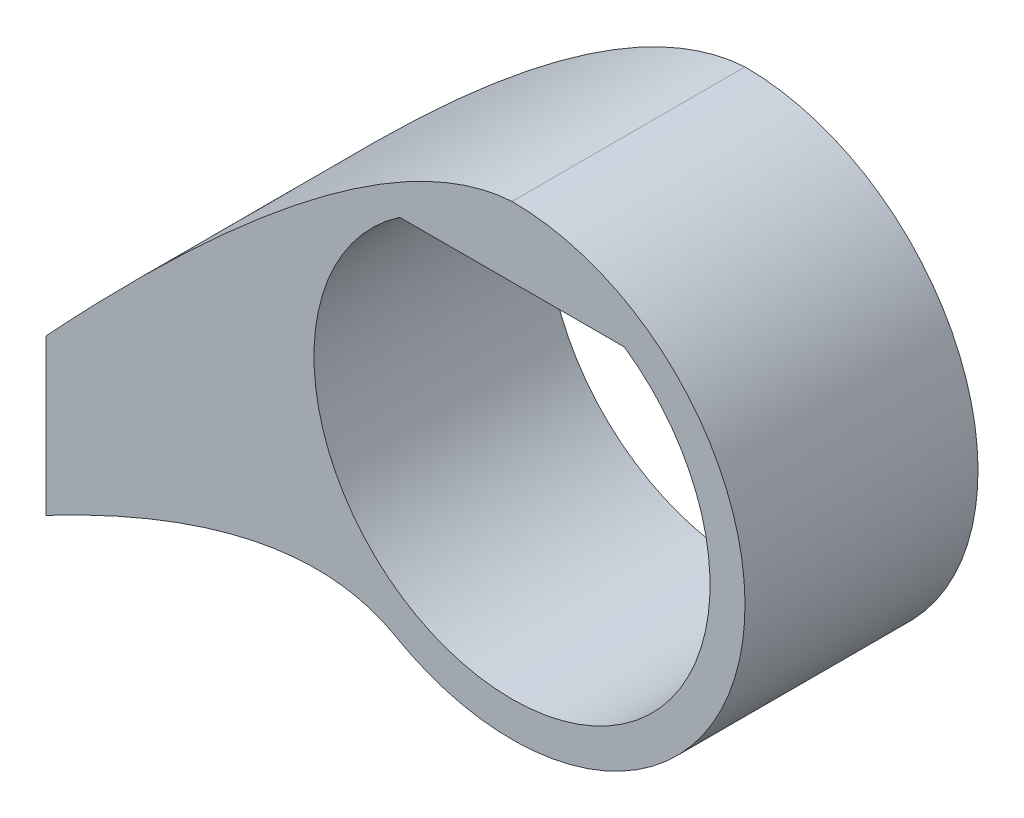
ISO-10303-21;
HEADER;
FILE_DESCRIPTION(('STEP AP214'),'2;1');
FILE_NAME('part.step','',(''),(''),'','','');
FILE_SCHEMA(('AUTOMOTIVE_DESIGN { 1 0 10303 214 1 1 1 1 }'));
ENDSEC;
DATA;
#1=APPLICATION_CONTEXT('core data for automotive mechanical design processes');
#2=APPLICATION_PROTOCOL_DEFINITION('international standard','automotive_design',2000,#1);
#3=PRODUCT_CONTEXT('',#1,'mechanical');
#4=PRODUCT('Part','Part','',(#3));
#5=PRODUCT_RELATED_PRODUCT_CATEGORY('part','',(#4));
#6=PRODUCT_DEFINITION_FORMATION('','',#4);
#7=PRODUCT_DEFINITION_CONTEXT('part definition',#1,'design');
#8=PRODUCT_DEFINITION('design','',#6,#7);
#9=PRODUCT_DEFINITION_SHAPE('','',#8);
#10=(LENGTH_UNIT() NAMED_UNIT(*) SI_UNIT(.MILLI.,.METRE.));
#11=(NAMED_UNIT(*) PLANE_ANGLE_UNIT() SI_UNIT($,.RADIAN.));
#12=(NAMED_UNIT(*) SI_UNIT($,.STERADIAN.) SOLID_ANGLE_UNIT());
#13=UNCERTAINTY_MEASURE_WITH_UNIT(LENGTH_MEASURE(1.E-05),#10,'distance_accuracy_value','');
#14=(GEOMETRIC_REPRESENTATION_CONTEXT(3) GLOBAL_UNCERTAINTY_ASSIGNED_CONTEXT((#13)) GLOBAL_UNIT_ASSIGNED_CONTEXT((#10,
#11,#12)) REPRESENTATION_CONTEXT('',''));
#15=CARTESIAN_POINT('',(0.,0.,0.));
#16=DIRECTION('',(0.,0.,1.));
#17=DIRECTION('',(1.,0.,0.));
#18=AXIS2_PLACEMENT_3D('',#15,#16,#17);
#19=CARTESIAN_POINT('',(-6.57712056852136,-4.88090089954708,6.));
#20=DIRECTION('',(0.,0.,1.));
#21=DIRECTION('',(1.,0.,0.));
#22=AXIS2_PLACEMENT_3D('',#19,#20,#21);
#23=PLANE('',#22);
#24=CARTESIAN_POINT('',(-12.,-7.,6.));
#25=CARTESIAN_POINT('',(-5.65424113704272,-3.66372558774084,6.));
#26=CARTESIAN_POINT('',(-3.,-5.19615242270663,6.));
#27=B_SPLINE_CURVE_WITH_KNOTS('',2,(#24,#25,#26),.UNSPECIFIED.,.F.,.F.,(3,3),(0.,
0.361848159329166),.UNSPECIFIED.);
#28=CARTESIAN_POINT('',(-12.,-7.,6.));
#29=VERTEX_POINT('',#28);
#30=CARTESIAN_POINT('',(-3.,-5.19615242270663,6.));
#31=VERTEX_POINT('',#30);
#32=EDGE_CURVE('E110',#29,#31,#27,.T.);
#33=ORIENTED_EDGE('',*,*,#32,.T.);
#34=CARTESIAN_POINT('',(0.,0.,6.));
#35=DIRECTION('',(0.,0.,1.));
#36=DIRECTION('',(1.,0.,0.));
#37=AXIS2_PLACEMENT_3D('',#34,#35,#36);
#38=CIRCLE('',#37,6.);
#39=CARTESIAN_POINT('',(0.,6.,6.));
#40=VERTEX_POINT('',#39);
#41=EDGE_CURVE('E116',#31,#40,#38,.T.);
#42=ORIENTED_EDGE('',*,*,#41,.T.);
#43=CARTESIAN_POINT('',(0.,6.,6.));
#44=CARTESIAN_POINT('',(-3.84641453313255,5.77126829641687,6.));
#45=CARTESIAN_POINT('',(-12.,-3.,6.));
#46=B_SPLINE_CURVE_WITH_KNOTS('',2,(#43,#44,#45),.UNSPECIFIED.,.F.,.F.,(3,3),(0.,
0.663529029496582),.UNSPECIFIED.);
#47=CARTESIAN_POINT('',(-12.,-3.,6.));
#48=VERTEX_POINT('',#47);
#49=EDGE_CURVE('E122',#40,#48,#46,.T.);
#50=ORIENTED_EDGE('',*,*,#49,.T.);
#51=DIRECTION('',(0.,-1.,0.));
#52=VECTOR('',#51,1.);
#53=CARTESIAN_POINT('',(-12.,-7.,6.));
#54=LINE('',#53,#52);
#55=EDGE_CURVE('E127',#48,#29,#54,.T.);
#56=ORIENTED_EDGE('',*,*,#55,.T.);
#57=EDGE_LOOP('',(#33,#42,#50,#56));
#58=FACE_BOUND('',#57,.T.);
#59=DIRECTION('',(-1.,0.,0.));
#60=VECTOR('',#59,1.);
#61=CARTESIAN_POINT('',(2.89309522829788,4.2,6.));
#62=LINE('',#61,#60);
#63=CARTESIAN_POINT('',(2.89309522829789,4.2,6.));
#64=VERTEX_POINT('',#63);
#65=CARTESIAN_POINT('',(-2.89309522829788,4.2,6.));
#66=VERTEX_POINT('',#65);
#67=EDGE_CURVE('E94',#64,#66,#62,.T.);
#68=ORIENTED_EDGE('',*,*,#67,.F.);
#69=CARTESIAN_POINT('',(0.,0.,6.));
#70=DIRECTION('',(0.,0.,1.));
#71=DIRECTION('',(1.,0.,0.));
#72=AXIS2_PLACEMENT_3D('',#69,#70,#71);
#73=CIRCLE('',#72,5.1);
#74=EDGE_CURVE('E100',#66,#64,#73,.T.);
#75=ORIENTED_EDGE('',*,*,#74,.F.);
#76=EDGE_LOOP('',(#68,#75));
#77=FACE_BOUND('',#76,.T.);
#78=ADVANCED_FACE('F41',(#58,#77),#23,.T.);
#79=CARTESIAN_POINT('',(-6.57712056852136,-4.88090089954708,0.));
#80=DIRECTION('',(0.,0.,1.));
#81=DIRECTION('',(1.,0.,0.));
#82=AXIS2_PLACEMENT_3D('',#79,#80,#81);
#83=PLANE('',#82);
#84=CARTESIAN_POINT('',(-12.,-7.,0.));
#85=CARTESIAN_POINT('',(-5.65424113704272,-3.66372558774084,0.));
#86=CARTESIAN_POINT('',(-3.,-5.19615242270663,0.));
#87=B_SPLINE_CURVE_WITH_KNOTS('',2,(#84,#85,#86),.UNSPECIFIED.,.F.,.F.,(3,3),(0.,
0.361848159329166),.UNSPECIFIED.);
#88=CARTESIAN_POINT('',(-12.,-7.,0.));
#89=VERTEX_POINT('',#88);
#90=CARTESIAN_POINT('',(-3.,-5.19615242270663,0.));
#91=VERTEX_POINT('',#90);
#92=EDGE_CURVE('E109',#89,#91,#87,.T.);
#93=ORIENTED_EDGE('',*,*,#92,.F.);
#94=DIRECTION('',(0.,-1.,0.));
#95=VECTOR('',#94,1.);
#96=CARTESIAN_POINT('',(-12.,-7.,0.));
#97=LINE('',#96,#95);
#98=CARTESIAN_POINT('',(-12.,-3.,0.));
#99=VERTEX_POINT('',#98);
#100=EDGE_CURVE('E117',#99,#89,#97,.T.);
#101=ORIENTED_EDGE('',*,*,#100,.F.);
#102=CARTESIAN_POINT('',(0.,6.,0.));
#103=CARTESIAN_POINT('',(-3.84641453313255,5.77126829641687,0.));
#104=CARTESIAN_POINT('',(-12.,-3.,0.));
#105=B_SPLINE_CURVE_WITH_KNOTS('',2,(#102,#103,#104),.UNSPECIFIED.,.F.,.F.,(3,3),(0.,
0.663529029496582),.UNSPECIFIED.);
#106=CARTESIAN_POINT('',(0.,6.,0.));
#107=VERTEX_POINT('',#106);
#108=EDGE_CURVE('E215',#107,#99,#105,.T.);
#109=ORIENTED_EDGE('',*,*,#108,.F.);
#110=CARTESIAN_POINT('',(0.,0.,0.));
#111=DIRECTION('',(0.,0.,1.));
#112=DIRECTION('',(1.,0.,0.));
#113=AXIS2_PLACEMENT_3D('',#110,#111,#112);
#114=CIRCLE('',#113,6.);
#115=EDGE_CURVE('E221',#91,#107,#114,.T.);
#116=ORIENTED_EDGE('',*,*,#115,.F.);
#117=EDGE_LOOP('',(#93,#101,#109,#116));
#118=FACE_BOUND('',#117,.T.);
#119=CARTESIAN_POINT('',(0.,0.,0.));
#120=DIRECTION('',(0.,0.,1.));
#121=DIRECTION('',(1.,0.,0.));
#122=AXIS2_PLACEMENT_3D('',#119,#120,#121);
#123=CIRCLE('',#122,5.1);
#124=CARTESIAN_POINT('',(-2.89309522829788,4.2,0.));
#125=VERTEX_POINT('',#124);
#126=CARTESIAN_POINT('',(2.89309522829788,4.2,0.));
#127=VERTEX_POINT('',#126);
#128=EDGE_CURVE('E64',#125,#127,#123,.T.);
#129=ORIENTED_EDGE('',*,*,#128,.T.);
#130=DIRECTION('',(-1.,0.,0.));
#131=VECTOR('',#130,1.);
#132=CARTESIAN_POINT('',(2.89309522829788,4.2,0.));
#133=LINE('',#132,#131);
#134=EDGE_CURVE('E104',#127,#125,#133,.T.);
#135=ORIENTED_EDGE('',*,*,#134,.T.);
#136=EDGE_LOOP('',(#129,#135));
#137=FACE_BOUND('',#136,.T.);
#138=ADVANCED_FACE('F145',(#118,#137),#83,.F.);
#139=DIRECTION('',(0.,0.,-1.));
#140=VECTOR('',#139,1.);
#141=SURFACE_OF_LINEAR_EXTRUSION('',#27,#140);
#142=ORIENTED_EDGE('',*,*,#92,.T.);
#143=DIRECTION('',(0.,0.,-1.));
#144=VECTOR('',#143,1.);
#145=CARTESIAN_POINT('',(-3.,-5.19615242270663,6.));
#146=LINE('',#145,#144);
#147=EDGE_CURVE('E11',#31,#91,#146,.T.);
#148=ORIENTED_EDGE('',*,*,#147,.F.);
#149=ORIENTED_EDGE('',*,*,#32,.F.);
#150=DIRECTION('',(0.,0.,-1.));
#151=VECTOR('',#150,1.);
#152=CARTESIAN_POINT('',(-12.,-7.,6.));
#153=LINE('',#152,#151);
#154=EDGE_CURVE('E209',#29,#89,#153,.T.);
#155=ORIENTED_EDGE('',*,*,#154,.T.);
#156=EDGE_LOOP('',(#142,#148,#149,#155));
#157=FACE_BOUND('',#156,.T.);
#158=ADVANCED_FACE('F43',(#157),#141,.F.);
#159=CARTESIAN_POINT('',(0.,0.,6.));
#160=DIRECTION('',(0.,0.,-1.));
#161=DIRECTION('',(-1.,0.,0.));
#162=AXIS2_PLACEMENT_3D('',#159,#160,#161);
#163=CYLINDRICAL_SURFACE('',#162,6.);
#164=ORIENTED_EDGE('',*,*,#115,.T.);
#165=DIRECTION('',(0.,0.,-1.));
#166=VECTOR('',#165,1.);
#167=CARTESIAN_POINT('',(0.,6.,6.));
#168=LINE('',#167,#166);
#169=EDGE_CURVE('E50',#40,#107,#168,.T.);
#170=ORIENTED_EDGE('',*,*,#169,.F.);
#171=ORIENTED_EDGE('',*,*,#41,.F.);
#172=ORIENTED_EDGE('',*,*,#147,.T.);
#173=EDGE_LOOP('',(#164,#170,#171,#172));
#174=FACE_BOUND('',#173,.T.);
#175=ADVANCED_FACE('F137',(#174),#163,.T.);
#176=DIRECTION('',(0.,0.,-1.));
#177=VECTOR('',#176,1.);
#178=SURFACE_OF_LINEAR_EXTRUSION('',#46,#177);
#179=ORIENTED_EDGE('',*,*,#108,.T.);
#180=DIRECTION('',(0.,0.,-1.));
#181=VECTOR('',#180,1.);
#182=CARTESIAN_POINT('',(-12.,-3.,6.));
#183=LINE('',#182,#181);
#184=EDGE_CURVE('E212',#48,#99,#183,.T.);
#185=ORIENTED_EDGE('',*,*,#184,.F.);
#186=ORIENTED_EDGE('',*,*,#49,.F.);
#187=ORIENTED_EDGE('',*,*,#169,.T.);
#188=EDGE_LOOP('',(#179,#185,#186,#187));
#189=FACE_BOUND('',#188,.T.);
#190=ADVANCED_FACE('F133',(#189),#178,.F.);
#191=CARTESIAN_POINT('',(-12.,-7.,6.));
#192=DIRECTION('',(1.,0.,0.));
#193=DIRECTION('',(0.,0.,-1.));
#194=AXIS2_PLACEMENT_3D('',#191,#192,#193);
#195=PLANE('',#194);
#196=ORIENTED_EDGE('',*,*,#100,.T.);
#197=ORIENTED_EDGE('',*,*,#154,.F.);
#198=ORIENTED_EDGE('',*,*,#55,.F.);
#199=ORIENTED_EDGE('',*,*,#184,.T.);
#200=EDGE_LOOP('',(#196,#197,#198,#199));
#201=FACE_BOUND('',#200,.T.);
#202=ADVANCED_FACE('F136',(#201),#195,.F.);
#203=CARTESIAN_POINT('',(0.,0.,6.));
#204=DIRECTION('',(0.,0.,-1.));
#205=DIRECTION('',(-1.,0.,0.));
#206=AXIS2_PLACEMENT_3D('',#203,#204,#205);
#207=CYLINDRICAL_SURFACE('',#206,5.1);
#208=ORIENTED_EDGE('',*,*,#128,.F.);
#209=DIRECTION('',(0.,0.,-1.));
#210=VECTOR('',#209,1.);
#211=CARTESIAN_POINT('',(-2.89309522829788,4.2,6.));
#212=LINE('',#211,#210);
#213=EDGE_CURVE('E96',#66,#125,#212,.T.);
#214=ORIENTED_EDGE('',*,*,#213,.F.);
#215=ORIENTED_EDGE('',*,*,#74,.T.);
#216=DIRECTION('',(0.,0.,-1.));
#217=VECTOR('',#216,1.);
#218=CARTESIAN_POINT('',(2.89309522829788,4.2,6.));
#219=LINE('',#218,#217);
#220=EDGE_CURVE('E57',#64,#127,#219,.T.);
#221=ORIENTED_EDGE('',*,*,#220,.T.);
#222=EDGE_LOOP('',(#208,#214,#215,#221));
#223=FACE_BOUND('',#222,.T.);
#224=ADVANCED_FACE('F102',(#223),#207,.F.);
#225=CARTESIAN_POINT('',(2.89309522829788,4.2,6.));
#226=DIRECTION('',(0.,-1.,0.));
#227=DIRECTION('',(0.,0.,-1.));
#228=AXIS2_PLACEMENT_3D('',#225,#226,#227);
#229=PLANE('',#228);
#230=ORIENTED_EDGE('',*,*,#134,.F.);
#231=ORIENTED_EDGE('',*,*,#220,.F.);
#232=ORIENTED_EDGE('',*,*,#67,.T.);
#233=ORIENTED_EDGE('',*,*,#213,.T.);
#234=EDGE_LOOP('',(#230,#231,#232,#233));
#235=FACE_BOUND('',#234,.T.);
#236=ADVANCED_FACE('F95',(#235),#229,.T.);
#237=CLOSED_SHELL('',(#78,#138,#158,#175,#190,#202,#224,#236));
#238=MANIFOLD_SOLID_BREP('B2',#237);
#239=ADVANCED_BREP_SHAPE_REPRESENTATION('',(#18,#238),#14);
#240=SHAPE_DEFINITION_REPRESENTATION(#9,#239);
ENDSEC;
END-ISO-10303-21;
